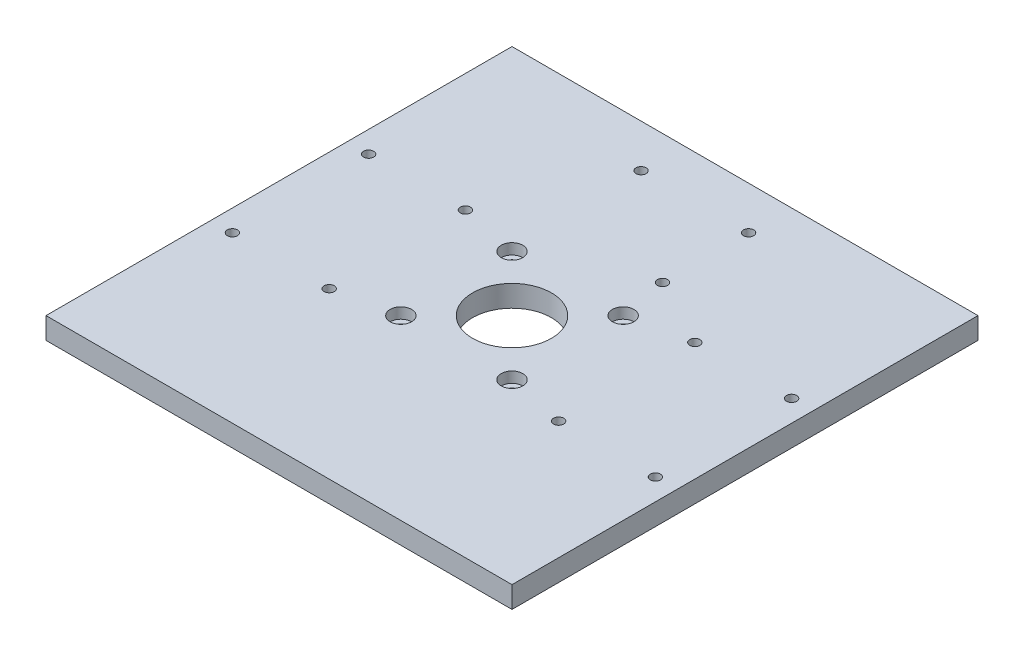
ISO-10303-21;
HEADER;
FILE_DESCRIPTION(('STEP AP214'),'2;1');
FILE_NAME('part.step','',(''),(''),'','','');
FILE_SCHEMA(('AUTOMOTIVE_DESIGN { 1 0 10303 214 1 1 1 1 }'));
ENDSEC;
DATA;
#1=APPLICATION_CONTEXT('core data for automotive mechanical design processes');
#2=APPLICATION_PROTOCOL_DEFINITION('international standard','automotive_design',2000,#1);
#3=PRODUCT_CONTEXT('',#1,'mechanical');
#4=PRODUCT('Part','Part','',(#3));
#5=PRODUCT_RELATED_PRODUCT_CATEGORY('part','',(#4));
#6=PRODUCT_DEFINITION_FORMATION('','',#4);
#7=PRODUCT_DEFINITION_CONTEXT('part definition',#1,'design');
#8=PRODUCT_DEFINITION('design','',#6,#7);
#9=PRODUCT_DEFINITION_SHAPE('','',#8);
#10=(LENGTH_UNIT() NAMED_UNIT(*) SI_UNIT(.MILLI.,.METRE.));
#11=(NAMED_UNIT(*) PLANE_ANGLE_UNIT() SI_UNIT($,.RADIAN.));
#12=(NAMED_UNIT(*) SI_UNIT($,.STERADIAN.) SOLID_ANGLE_UNIT());
#13=UNCERTAINTY_MEASURE_WITH_UNIT(LENGTH_MEASURE(1.E-05),#10,'distance_accuracy_value','');
#14=(GEOMETRIC_REPRESENTATION_CONTEXT(3) GLOBAL_UNCERTAINTY_ASSIGNED_CONTEXT((#13)) GLOBAL_UNIT_ASSIGNED_CONTEXT((#10,
#11,#12)) REPRESENTATION_CONTEXT('',''));
#15=CARTESIAN_POINT('',(0.,0.,0.));
#16=DIRECTION('',(0.,0.,1.));
#17=DIRECTION('',(1.,0.,0.));
#18=AXIS2_PLACEMENT_3D('',#15,#16,#17);
#19=CARTESIAN_POINT('',(-15.4999999999997,0.,15.5));
#20=DIRECTION('',(0.,1.,0.));
#21=DIRECTION('',(0.,0.,1.));
#22=AXIS2_PLACEMENT_3D('',#19,#20,#21);
#23=CYLINDRICAL_SURFACE('',#22,1.42);
#24=CARTESIAN_POINT('',(-15.4999999999997,0.,15.5));
#25=DIRECTION('',(0.,1.,0.));
#26=DIRECTION('',(0.,0.,1.));
#27=AXIS2_PLACEMENT_3D('',#24,#25,#26);
#28=CIRCLE('',#27,1.42);
#29=CARTESIAN_POINT('',(-15.4999999999997,0.,16.92));
#30=VERTEX_POINT('',#29);
#31=EDGE_CURVE('E118',#30,#30,#28,.T.);
#32=ORIENTED_EDGE('',*,*,#31,.F.);
#33=EDGE_LOOP('',(#32));
#34=FACE_BOUND('',#33,.T.);
#35=CARTESIAN_POINT('',(-15.4999999999997,3.,15.5));
#36=DIRECTION('',(0.,1.,0.));
#37=DIRECTION('',(0.,0.,1.));
#38=AXIS2_PLACEMENT_3D('',#35,#36,#37);
#39=CIRCLE('',#38,1.42);
#40=CARTESIAN_POINT('',(-15.4999999999997,3.,16.92));
#41=VERTEX_POINT('',#40);
#42=EDGE_CURVE('E127',#41,#41,#39,.F.);
#43=ORIENTED_EDGE('',*,*,#42,.F.);
#44=EDGE_LOOP('',(#43));
#45=FACE_BOUND('',#44,.T.);
#46=ADVANCED_FACE('F38',(#34,#45),#23,.F.);
#47=CARTESIAN_POINT('',(15.5000000000003,0.,15.5));
#48=DIRECTION('',(0.,1.,0.));
#49=DIRECTION('',(0.,0.,1.));
#50=AXIS2_PLACEMENT_3D('',#47,#48,#49);
#51=CYLINDRICAL_SURFACE('',#50,1.42);
#52=CARTESIAN_POINT('',(15.5000000000003,0.,15.5));
#53=DIRECTION('',(0.,1.,0.));
#54=DIRECTION('',(0.,0.,1.));
#55=AXIS2_PLACEMENT_3D('',#52,#53,#54);
#56=CIRCLE('',#55,1.42);
#57=CARTESIAN_POINT('',(15.5000000000003,0.,16.92));
#58=VERTEX_POINT('',#57);
#59=EDGE_CURVE('E223',#58,#58,#56,.T.);
#60=ORIENTED_EDGE('',*,*,#59,.F.);
#61=EDGE_LOOP('',(#60));
#62=FACE_BOUND('',#61,.T.);
#63=CARTESIAN_POINT('',(15.5000000000003,3.,15.5));
#64=DIRECTION('',(0.,1.,0.));
#65=DIRECTION('',(0.,0.,1.));
#66=AXIS2_PLACEMENT_3D('',#63,#64,#65);
#67=CIRCLE('',#66,1.42);
#68=CARTESIAN_POINT('',(15.5000000000003,3.,16.92));
#69=VERTEX_POINT('',#68);
#70=EDGE_CURVE('E123',#69,#69,#67,.F.);
#71=ORIENTED_EDGE('',*,*,#70,.F.);
#72=EDGE_LOOP('',(#71));
#73=FACE_BOUND('',#72,.T.);
#74=ADVANCED_FACE('F255',(#62,#73),#51,.F.);
#75=CARTESIAN_POINT('',(15.5,0.,-15.5));
#76=DIRECTION('',(0.,1.,0.));
#77=DIRECTION('',(0.,0.,1.));
#78=AXIS2_PLACEMENT_3D('',#75,#76,#77);
#79=CYLINDRICAL_SURFACE('',#78,1.42);
#80=CARTESIAN_POINT('',(15.5,0.,-15.5));
#81=DIRECTION('',(0.,1.,0.));
#82=DIRECTION('',(0.,0.,1.));
#83=AXIS2_PLACEMENT_3D('',#80,#81,#82);
#84=CIRCLE('',#83,1.42);
#85=CARTESIAN_POINT('',(15.5,0.,-14.08));
#86=VERTEX_POINT('',#85);
#87=EDGE_CURVE('E219',#86,#86,#84,.T.);
#88=ORIENTED_EDGE('',*,*,#87,.F.);
#89=EDGE_LOOP('',(#88));
#90=FACE_BOUND('',#89,.T.);
#91=CARTESIAN_POINT('',(15.5,3.,-15.5));
#92=DIRECTION('',(0.,1.,0.));
#93=DIRECTION('',(0.,0.,1.));
#94=AXIS2_PLACEMENT_3D('',#91,#92,#93);
#95=CIRCLE('',#94,1.42);
#96=CARTESIAN_POINT('',(15.5,3.,-14.08));
#97=VERTEX_POINT('',#96);
#98=EDGE_CURVE('E120',#97,#97,#95,.F.);
#99=ORIENTED_EDGE('',*,*,#98,.F.);
#100=EDGE_LOOP('',(#99));
#101=FACE_BOUND('',#100,.T.);
#102=ADVANCED_FACE('F261',(#90,#101),#79,.F.);
#103=CARTESIAN_POINT('',(-15.5,0.,-15.5));
#104=DIRECTION('',(0.,1.,0.));
#105=DIRECTION('',(0.,0.,1.));
#106=AXIS2_PLACEMENT_3D('',#103,#104,#105);
#107=CYLINDRICAL_SURFACE('',#106,1.42);
#108=CARTESIAN_POINT('',(-15.5,0.,-15.5));
#109=DIRECTION('',(0.,1.,0.));
#110=DIRECTION('',(0.,0.,1.));
#111=AXIS2_PLACEMENT_3D('',#108,#109,#110);
#112=CIRCLE('',#111,1.42);
#113=CARTESIAN_POINT('',(-15.5,0.,-14.08));
#114=VERTEX_POINT('',#113);
#115=EDGE_CURVE('E222',#114,#114,#112,.T.);
#116=ORIENTED_EDGE('',*,*,#115,.F.);
#117=EDGE_LOOP('',(#116));
#118=FACE_BOUND('',#117,.T.);
#119=CARTESIAN_POINT('',(-15.5,3.,-15.5));
#120=DIRECTION('',(0.,1.,0.));
#121=DIRECTION('',(0.,0.,1.));
#122=AXIS2_PLACEMENT_3D('',#119,#120,#121);
#123=CIRCLE('',#122,1.42);
#124=CARTESIAN_POINT('',(-15.5,3.,-14.08));
#125=VERTEX_POINT('',#124);
#126=EDGE_CURVE('E115',#125,#125,#123,.F.);
#127=ORIENTED_EDGE('',*,*,#126,.F.);
#128=EDGE_LOOP('',(#127));
#129=FACE_BOUND('',#128,.T.);
#130=ADVANCED_FACE('F267',(#118,#129),#107,.F.);
#131=CARTESIAN_POINT('',(0.,6.,0.));
#132=DIRECTION('',(0.,-1.,0.));
#133=DIRECTION('',(0.,0.,-1.));
#134=AXIS2_PLACEMENT_3D('',#131,#132,#133);
#135=PLANE('',#134);
#136=CARTESIAN_POINT('',(-17.,6.,-53.));
#137=DIRECTION('',(0.,1.,0.));
#138=DIRECTION('',(0.,0.,1.));
#139=AXIS2_PLACEMENT_3D('',#136,#137,#138);
#140=CIRCLE('',#139,1.42);
#141=CARTESIAN_POINT('',(-17.,6.,-51.58));
#142=VERTEX_POINT('',#141);
#143=EDGE_CURVE('E164',#142,#142,#140,.T.);
#144=ORIENTED_EDGE('',*,*,#143,.F.);
#145=EDGE_LOOP('',(#144));
#146=FACE_BOUND('',#145,.T.);
#147=CARTESIAN_POINT('',(13.,6.,-29.));
#148=DIRECTION('',(0.,1.,0.));
#149=DIRECTION('',(0.,0.,1.));
#150=AXIS2_PLACEMENT_3D('',#147,#148,#149);
#151=CIRCLE('',#150,1.42);
#152=CARTESIAN_POINT('',(13.,6.,-27.58));
#153=VERTEX_POINT('',#152);
#154=EDGE_CURVE('E169',#153,#153,#151,.T.);
#155=ORIENTED_EDGE('',*,*,#154,.F.);
#156=EDGE_LOOP('',(#155));
#157=FACE_BOUND('',#156,.T.);
#158=CARTESIAN_POINT('',(13.,6.,-53.));
#159=DIRECTION('',(0.,1.,0.));
#160=DIRECTION('',(0.,0.,1.));
#161=AXIS2_PLACEMENT_3D('',#158,#159,#160);
#162=CIRCLE('',#161,1.42);
#163=CARTESIAN_POINT('',(13.,6.,-51.58));
#164=VERTEX_POINT('',#163);
#165=EDGE_CURVE('E161',#164,#164,#162,.T.);
#166=ORIENTED_EDGE('',*,*,#165,.F.);
#167=EDGE_LOOP('',(#166));
#168=FACE_BOUND('',#167,.T.);
#169=CARTESIAN_POINT('',(-32.0000000000004,6.,-19.));
#170=DIRECTION('',(0.,1.,0.));
#171=DIRECTION('',(0.,0.,1.));
#172=AXIS2_PLACEMENT_3D('',#169,#170,#171);
#173=CIRCLE('',#172,1.42);
#174=CARTESIAN_POINT('',(-32.0000000000004,6.,-17.58));
#175=VERTEX_POINT('',#174);
#176=EDGE_CURVE('E140',#175,#175,#173,.T.);
#177=ORIENTED_EDGE('',*,*,#176,.F.);
#178=EDGE_LOOP('',(#177));
#179=FACE_BOUND('',#178,.T.);
#180=CARTESIAN_POINT('',(-32.,6.,19.));
#181=DIRECTION('',(0.,1.,0.));
#182=DIRECTION('',(0.,0.,1.));
#183=AXIS2_PLACEMENT_3D('',#180,#181,#182);
#184=CIRCLE('',#183,1.42);
#185=CARTESIAN_POINT('',(-32.,6.,20.42));
#186=VERTEX_POINT('',#185);
#187=EDGE_CURVE('E180',#186,#186,#184,.T.);
#188=ORIENTED_EDGE('',*,*,#187,.F.);
#189=EDGE_LOOP('',(#188));
#190=FACE_BOUND('',#189,.T.);
#191=CARTESIAN_POINT('',(-59.,6.,19.));
#192=DIRECTION('',(0.,1.,0.));
#193=DIRECTION('',(0.,0.,1.));
#194=AXIS2_PLACEMENT_3D('',#191,#192,#193);
#195=CIRCLE('',#194,1.42);
#196=CARTESIAN_POINT('',(-59.,6.,20.42));
#197=VERTEX_POINT('',#196);
#198=EDGE_CURVE('E183',#197,#197,#195,.T.);
#199=ORIENTED_EDGE('',*,*,#198,.F.);
#200=EDGE_LOOP('',(#199));
#201=FACE_BOUND('',#200,.T.);
#202=CARTESIAN_POINT('',(59.0000000000004,6.,-19.));
#203=DIRECTION('',(0.,1.,0.));
#204=DIRECTION('',(0.,0.,-1.));
#205=AXIS2_PLACEMENT_3D('',#202,#203,#204);
#206=CIRCLE('',#205,1.42);
#207=CARTESIAN_POINT('',(59.0000000000004,6.,-20.42));
#208=VERTEX_POINT('',#207);
#209=EDGE_CURVE('E186',#208,#208,#206,.T.);
#210=ORIENTED_EDGE('',*,*,#209,.F.);
#211=EDGE_LOOP('',(#210));
#212=FACE_BOUND('',#211,.T.);
#213=CARTESIAN_POINT('',(59.,6.,18.9999999999999));
#214=DIRECTION('',(0.,1.,0.));
#215=DIRECTION('',(0.,0.,-1.));
#216=AXIS2_PLACEMENT_3D('',#213,#214,#215);
#217=CIRCLE('',#216,1.42);
#218=CARTESIAN_POINT('',(59.,6.,17.5799999999999));
#219=VERTEX_POINT('',#218);
#220=EDGE_CURVE('E189',#219,#219,#217,.T.);
#221=ORIENTED_EDGE('',*,*,#220,.F.);
#222=EDGE_LOOP('',(#221));
#223=FACE_BOUND('',#222,.T.);
#224=CARTESIAN_POINT('',(32.,6.,18.9999999999999));
#225=DIRECTION('',(0.,1.,0.));
#226=DIRECTION('',(0.,0.,-1.));
#227=AXIS2_PLACEMENT_3D('',#224,#225,#226);
#228=CIRCLE('',#227,1.42);
#229=CARTESIAN_POINT('',(32.,6.,17.5799999999999));
#230=VERTEX_POINT('',#229);
#231=EDGE_CURVE('E192',#230,#230,#228,.T.);
#232=ORIENTED_EDGE('',*,*,#231,.F.);
#233=EDGE_LOOP('',(#232));
#234=FACE_BOUND('',#233,.T.);
#235=CARTESIAN_POINT('',(32.0000000000004,6.,-19.));
#236=DIRECTION('',(0.,1.,0.));
#237=DIRECTION('',(0.,0.,-1.));
#238=AXIS2_PLACEMENT_3D('',#235,#236,#237);
#239=CIRCLE('',#238,1.42);
#240=CARTESIAN_POINT('',(32.0000000000004,6.,-20.42));
#241=VERTEX_POINT('',#240);
#242=EDGE_CURVE('E160',#241,#241,#239,.T.);
#243=ORIENTED_EDGE('',*,*,#242,.F.);
#244=EDGE_LOOP('',(#243));
#245=FACE_BOUND('',#244,.T.);
#246=CARTESIAN_POINT('',(-59.0000000000004,6.,-19.));
#247=DIRECTION('',(0.,1.,0.));
#248=DIRECTION('',(0.,0.,1.));
#249=AXIS2_PLACEMENT_3D('',#246,#247,#248);
#250=CIRCLE('',#249,1.42);
#251=CARTESIAN_POINT('',(-59.0000000000004,6.,-17.58));
#252=VERTEX_POINT('',#251);
#253=EDGE_CURVE('E135',#252,#252,#250,.T.);
#254=ORIENTED_EDGE('',*,*,#253,.F.);
#255=EDGE_LOOP('',(#254));
#256=FACE_BOUND('',#255,.T.);
#257=CARTESIAN_POINT('',(15.5,6.,-15.5));
#258=DIRECTION('',(0.,1.,0.));
#259=DIRECTION('',(0.,0.,1.));
#260=AXIS2_PLACEMENT_3D('',#257,#258,#259);
#261=CIRCLE('',#260,3.);
#262=CARTESIAN_POINT('',(15.5,6.,-12.5));
#263=VERTEX_POINT('',#262);
#264=EDGE_CURVE('E201',#263,#263,#261,.T.);
#265=ORIENTED_EDGE('',*,*,#264,.F.);
#266=EDGE_LOOP('',(#265));
#267=FACE_BOUND('',#266,.T.);
#268=CARTESIAN_POINT('',(15.5000000000003,6.,15.5));
#269=DIRECTION('',(0.,1.,0.));
#270=DIRECTION('',(0.,0.,1.));
#271=AXIS2_PLACEMENT_3D('',#268,#269,#270);
#272=CIRCLE('',#271,3.);
#273=CARTESIAN_POINT('',(15.5000000000003,6.,18.5));
#274=VERTEX_POINT('',#273);
#275=EDGE_CURVE('E207',#274,#274,#272,.T.);
#276=ORIENTED_EDGE('',*,*,#275,.F.);
#277=EDGE_LOOP('',(#276));
#278=FACE_BOUND('',#277,.T.);
#279=CARTESIAN_POINT('',(-15.4999999999997,6.,15.5));
#280=DIRECTION('',(0.,1.,0.));
#281=DIRECTION('',(0.,0.,1.));
#282=AXIS2_PLACEMENT_3D('',#279,#280,#281);
#283=CIRCLE('',#282,3.);
#284=CARTESIAN_POINT('',(-15.4999999999997,6.,18.5));
#285=VERTEX_POINT('',#284);
#286=EDGE_CURVE('E134',#285,#285,#283,.T.);
#287=ORIENTED_EDGE('',*,*,#286,.F.);
#288=EDGE_LOOP('',(#287));
#289=FACE_BOUND('',#288,.T.);
#290=CARTESIAN_POINT('',(-15.5,6.,-15.5));
#291=DIRECTION('',(0.,1.,0.));
#292=DIRECTION('',(0.,0.,1.));
#293=AXIS2_PLACEMENT_3D('',#290,#291,#292);
#294=CIRCLE('',#293,3.);
#295=CARTESIAN_POINT('',(-15.5,6.,-12.5));
#296=VERTEX_POINT('',#295);
#297=EDGE_CURVE('E130',#296,#296,#294,.T.);
#298=ORIENTED_EDGE('',*,*,#297,.F.);
#299=EDGE_LOOP('',(#298));
#300=FACE_BOUND('',#299,.T.);
#301=DIRECTION('',(0.,0.,-1.));
#302=VECTOR('',#301,1.);
#303=CARTESIAN_POINT('',(65.,6.,65.));
#304=LINE('',#303,#302);
#305=CARTESIAN_POINT('',(65.,6.,65.));
#306=VERTEX_POINT('',#305);
#307=CARTESIAN_POINT('',(65.,6.,-65.));
#308=VERTEX_POINT('',#307);
#309=EDGE_CURVE('E93',#306,#308,#304,.T.);
#310=ORIENTED_EDGE('',*,*,#309,.T.);
#311=DIRECTION('',(-1.,0.,0.));
#312=VECTOR('',#311,1.);
#313=CARTESIAN_POINT('',(-65.,6.,-65.));
#314=LINE('',#313,#312);
#315=CARTESIAN_POINT('',(-65.,6.,-65.));
#316=VERTEX_POINT('',#315);
#317=EDGE_CURVE('E87',#308,#316,#314,.T.);
#318=ORIENTED_EDGE('',*,*,#317,.T.);
#319=DIRECTION('',(0.,0.,1.));
#320=VECTOR('',#319,1.);
#321=CARTESIAN_POINT('',(-65.,6.,65.));
#322=LINE('',#321,#320);
#323=CARTESIAN_POINT('',(-65.,6.,65.));
#324=VERTEX_POINT('',#323);
#325=EDGE_CURVE('E91',#316,#324,#322,.T.);
#326=ORIENTED_EDGE('',*,*,#325,.T.);
#327=DIRECTION('',(1.,0.,0.));
#328=VECTOR('',#327,1.);
#329=CARTESIAN_POINT('',(-65.,6.,65.));
#330=LINE('',#329,#328);
#331=EDGE_CURVE('E57',#324,#306,#330,.T.);
#332=ORIENTED_EDGE('',*,*,#331,.T.);
#333=EDGE_LOOP('',(#310,#318,#326,#332));
#334=FACE_BOUND('',#333,.T.);
#335=CARTESIAN_POINT('',(0.,6.,0.));
#336=DIRECTION('',(0.,1.,0.));
#337=DIRECTION('',(0.,0.,1.));
#338=AXIS2_PLACEMENT_3D('',#335,#336,#337);
#339=CIRCLE('',#338,11.);
#340=CARTESIAN_POINT('',(0.,6.,11.));
#341=VERTEX_POINT('',#340);
#342=EDGE_CURVE('E109',#341,#341,#339,.T.);
#343=ORIENTED_EDGE('',*,*,#342,.F.);
#344=EDGE_LOOP('',(#343));
#345=FACE_BOUND('',#344,.T.);
#346=ADVANCED_FACE('F88',(#146,#157,#168,#179,#190,#201,#212,#223,#234,#245,#256,#267,#278,#289,
#300,#334,#345),#135,.F.);
#347=CARTESIAN_POINT('',(0.,0.,0.));
#348=DIRECTION('',(0.,-1.,0.));
#349=DIRECTION('',(0.,0.,-1.));
#350=AXIS2_PLACEMENT_3D('',#347,#348,#349);
#351=PLANE('',#350);
#352=CARTESIAN_POINT('',(-17.,0.,-53.));
#353=DIRECTION('',(0.,-1.,0.));
#354=DIRECTION('',(0.,0.,-1.));
#355=AXIS2_PLACEMENT_3D('',#352,#353,#354);
#356=CIRCLE('',#355,1.42);
#357=CARTESIAN_POINT('',(-17.,0.,-54.42));
#358=VERTEX_POINT('',#357);
#359=EDGE_CURVE('E42',#358,#358,#356,.T.);
#360=ORIENTED_EDGE('',*,*,#359,.F.);
#361=EDGE_LOOP('',(#360));
#362=FACE_BOUND('',#361,.T.);
#363=CARTESIAN_POINT('',(13.,0.,-29.));
#364=DIRECTION('',(0.,-1.,0.));
#365=DIRECTION('',(0.,0.,-1.));
#366=AXIS2_PLACEMENT_3D('',#363,#364,#365);
#367=CIRCLE('',#366,1.42);
#368=CARTESIAN_POINT('',(13.,0.,-30.42));
#369=VERTEX_POINT('',#368);
#370=EDGE_CURVE('E162',#369,#369,#367,.T.);
#371=ORIENTED_EDGE('',*,*,#370,.F.);
#372=EDGE_LOOP('',(#371));
#373=FACE_BOUND('',#372,.T.);
#374=CARTESIAN_POINT('',(13.,0.,-53.));
#375=DIRECTION('',(0.,-1.,0.));
#376=DIRECTION('',(0.,0.,-1.));
#377=AXIS2_PLACEMENT_3D('',#374,#375,#376);
#378=CIRCLE('',#377,1.42);
#379=CARTESIAN_POINT('',(13.,0.,-54.42));
#380=VERTEX_POINT('',#379);
#381=EDGE_CURVE('E158',#380,#380,#378,.T.);
#382=ORIENTED_EDGE('',*,*,#381,.F.);
#383=EDGE_LOOP('',(#382));
#384=FACE_BOUND('',#383,.T.);
#385=CARTESIAN_POINT('',(-32.0000000000004,0.,-19.));
#386=DIRECTION('',(0.,-1.,0.));
#387=DIRECTION('',(0.,0.,-1.));
#388=AXIS2_PLACEMENT_3D('',#385,#386,#387);
#389=CIRCLE('',#388,1.42);
#390=CARTESIAN_POINT('',(-32.0000000000004,0.,-20.42));
#391=VERTEX_POINT('',#390);
#392=EDGE_CURVE('E155',#391,#391,#389,.T.);
#393=ORIENTED_EDGE('',*,*,#392,.F.);
#394=EDGE_LOOP('',(#393));
#395=FACE_BOUND('',#394,.T.);
#396=CARTESIAN_POINT('',(-32.,0.,19.));
#397=DIRECTION('',(0.,-1.,0.));
#398=DIRECTION('',(0.,0.,-1.));
#399=AXIS2_PLACEMENT_3D('',#396,#397,#398);
#400=CIRCLE('',#399,1.42);
#401=CARTESIAN_POINT('',(-32.,0.,17.58));
#402=VERTEX_POINT('',#401);
#403=EDGE_CURVE('E152',#402,#402,#400,.T.);
#404=ORIENTED_EDGE('',*,*,#403,.F.);
#405=EDGE_LOOP('',(#404));
#406=FACE_BOUND('',#405,.T.);
#407=CARTESIAN_POINT('',(-59.,0.,19.));
#408=DIRECTION('',(0.,-1.,0.));
#409=DIRECTION('',(0.,0.,-1.));
#410=AXIS2_PLACEMENT_3D('',#407,#408,#409);
#411=CIRCLE('',#410,1.42);
#412=CARTESIAN_POINT('',(-59.,0.,17.58));
#413=VERTEX_POINT('',#412);
#414=EDGE_CURVE('E149',#413,#413,#411,.T.);
#415=ORIENTED_EDGE('',*,*,#414,.F.);
#416=EDGE_LOOP('',(#415));
#417=FACE_BOUND('',#416,.T.);
#418=CARTESIAN_POINT('',(59.0000000000004,0.,-19.));
#419=DIRECTION('',(0.,-1.,0.));
#420=DIRECTION('',(0.,0.,-1.));
#421=AXIS2_PLACEMENT_3D('',#418,#419,#420);
#422=CIRCLE('',#421,1.42);
#423=CARTESIAN_POINT('',(59.0000000000004,0.,-20.42));
#424=VERTEX_POINT('',#423);
#425=EDGE_CURVE('E146',#424,#424,#422,.T.);
#426=ORIENTED_EDGE('',*,*,#425,.F.);
#427=EDGE_LOOP('',(#426));
#428=FACE_BOUND('',#427,.T.);
#429=CARTESIAN_POINT('',(59.,0.,18.9999999999999));
#430=DIRECTION('',(0.,-1.,0.));
#431=DIRECTION('',(0.,0.,-1.));
#432=AXIS2_PLACEMENT_3D('',#429,#430,#431);
#433=CIRCLE('',#432,1.42);
#434=CARTESIAN_POINT('',(59.,0.,17.5799999999999));
#435=VERTEX_POINT('',#434);
#436=EDGE_CURVE('E143',#435,#435,#433,.T.);
#437=ORIENTED_EDGE('',*,*,#436,.F.);
#438=EDGE_LOOP('',(#437));
#439=FACE_BOUND('',#438,.T.);
#440=CARTESIAN_POINT('',(32.,0.,18.9999999999999));
#441=DIRECTION('',(0.,-1.,0.));
#442=DIRECTION('',(0.,0.,-1.));
#443=AXIS2_PLACEMENT_3D('',#440,#441,#442);
#444=CIRCLE('',#443,1.42);
#445=CARTESIAN_POINT('',(32.,0.,17.5799999999999));
#446=VERTEX_POINT('',#445);
#447=EDGE_CURVE('E139',#446,#446,#444,.T.);
#448=ORIENTED_EDGE('',*,*,#447,.F.);
#449=EDGE_LOOP('',(#448));
#450=FACE_BOUND('',#449,.T.);
#451=CARTESIAN_POINT('',(32.0000000000004,0.,-19.));
#452=DIRECTION('',(0.,-1.,0.));
#453=DIRECTION('',(0.,0.,-1.));
#454=AXIS2_PLACEMENT_3D('',#451,#452,#453);
#455=CIRCLE('',#454,1.42);
#456=CARTESIAN_POINT('',(32.0000000000004,0.,-20.42));
#457=VERTEX_POINT('',#456);
#458=EDGE_CURVE('E136',#457,#457,#455,.T.);
#459=ORIENTED_EDGE('',*,*,#458,.F.);
#460=EDGE_LOOP('',(#459));
#461=FACE_BOUND('',#460,.T.);
#462=CARTESIAN_POINT('',(-59.0000000000004,0.,-19.));
#463=DIRECTION('',(0.,-1.,0.));
#464=DIRECTION('',(0.,0.,-1.));
#465=AXIS2_PLACEMENT_3D('',#462,#463,#464);
#466=CIRCLE('',#465,1.42);
#467=CARTESIAN_POINT('',(-59.0000000000004,0.,-20.42));
#468=VERTEX_POINT('',#467);
#469=EDGE_CURVE('E131',#468,#468,#466,.T.);
#470=ORIENTED_EDGE('',*,*,#469,.F.);
#471=EDGE_LOOP('',(#470));
#472=FACE_BOUND('',#471,.T.);
#473=ORIENTED_EDGE('',*,*,#87,.T.);
#474=EDGE_LOOP('',(#473));
#475=FACE_BOUND('',#474,.T.);
#476=ORIENTED_EDGE('',*,*,#59,.T.);
#477=EDGE_LOOP('',(#476));
#478=FACE_BOUND('',#477,.T.);
#479=ORIENTED_EDGE('',*,*,#31,.T.);
#480=EDGE_LOOP('',(#479));
#481=FACE_BOUND('',#480,.T.);
#482=ORIENTED_EDGE('',*,*,#115,.T.);
#483=EDGE_LOOP('',(#482));
#484=FACE_BOUND('',#483,.T.);
#485=DIRECTION('',(0.,0.,-1.));
#486=VECTOR('',#485,1.);
#487=CARTESIAN_POINT('',(65.,0.,65.));
#488=LINE('',#487,#486);
#489=CARTESIAN_POINT('',(65.,0.,65.));
#490=VERTEX_POINT('',#489);
#491=CARTESIAN_POINT('',(65.,0.,-65.));
#492=VERTEX_POINT('',#491);
#493=EDGE_CURVE('E106',#490,#492,#488,.T.);
#494=ORIENTED_EDGE('',*,*,#493,.F.);
#495=DIRECTION('',(1.,0.,0.));
#496=VECTOR('',#495,1.);
#497=CARTESIAN_POINT('',(-65.,0.,65.));
#498=LINE('',#497,#496);
#499=CARTESIAN_POINT('',(-65.,0.,65.));
#500=VERTEX_POINT('',#499);
#501=EDGE_CURVE('E80',#500,#490,#498,.T.);
#502=ORIENTED_EDGE('',*,*,#501,.F.);
#503=DIRECTION('',(0.,0.,1.));
#504=VECTOR('',#503,1.);
#505=CARTESIAN_POINT('',(-65.,0.,65.));
#506=LINE('',#505,#504);
#507=CARTESIAN_POINT('',(-65.,0.,-65.));
#508=VERTEX_POINT('',#507);
#509=EDGE_CURVE('E74',#508,#500,#506,.T.);
#510=ORIENTED_EDGE('',*,*,#509,.F.);
#511=DIRECTION('',(-1.,0.,0.));
#512=VECTOR('',#511,1.);
#513=CARTESIAN_POINT('',(-65.,0.,-65.));
#514=LINE('',#513,#512);
#515=EDGE_CURVE('E97',#492,#508,#514,.T.);
#516=ORIENTED_EDGE('',*,*,#515,.F.);
#517=EDGE_LOOP('',(#494,#502,#510,#516));
#518=FACE_BOUND('',#517,.T.);
#519=CARTESIAN_POINT('',(0.,0.,0.));
#520=DIRECTION('',(0.,1.,0.));
#521=DIRECTION('',(0.,0.,1.));
#522=AXIS2_PLACEMENT_3D('',#519,#520,#521);
#523=CIRCLE('',#522,11.);
#524=CARTESIAN_POINT('',(0.,0.,11.));
#525=VERTEX_POINT('',#524);
#526=EDGE_CURVE('E230',#525,#525,#523,.T.);
#527=ORIENTED_EDGE('',*,*,#526,.T.);
#528=EDGE_LOOP('',(#527));
#529=FACE_BOUND('',#528,.T.);
#530=ADVANCED_FACE('F236',(#362,#373,#384,#395,#406,#417,#428,#439,#450,#461,#472,#475,#478,
#481,#484,#518,#529),#351,.T.);
#531=CARTESIAN_POINT('',(65.,6.,65.));
#532=DIRECTION('',(-1.,0.,0.));
#533=DIRECTION('',(0.,0.,1.));
#534=AXIS2_PLACEMENT_3D('',#531,#532,#533);
#535=PLANE('',#534);
#536=ORIENTED_EDGE('',*,*,#493,.T.);
#537=DIRECTION('',(0.,-1.,0.));
#538=VECTOR('',#537,1.);
#539=CARTESIAN_POINT('',(65.,6.,-65.));
#540=LINE('',#539,#538);
#541=EDGE_CURVE('E11',#308,#492,#540,.T.);
#542=ORIENTED_EDGE('',*,*,#541,.F.);
#543=ORIENTED_EDGE('',*,*,#309,.F.);
#544=DIRECTION('',(0.,-1.,0.));
#545=VECTOR('',#544,1.);
#546=CARTESIAN_POINT('',(65.,6.,65.));
#547=LINE('',#546,#545);
#548=EDGE_CURVE('E102',#306,#490,#547,.T.);
#549=ORIENTED_EDGE('',*,*,#548,.T.);
#550=EDGE_LOOP('',(#536,#542,#543,#549));
#551=FACE_BOUND('',#550,.T.);
#552=ADVANCED_FACE('F40',(#551),#535,.F.);
#553=CARTESIAN_POINT('',(-65.,6.,-65.));
#554=DIRECTION('',(0.,0.,1.));
#555=DIRECTION('',(1.,0.,0.));
#556=AXIS2_PLACEMENT_3D('',#553,#554,#555);
#557=PLANE('',#556);
#558=ORIENTED_EDGE('',*,*,#515,.T.);
#559=DIRECTION('',(0.,-1.,0.));
#560=VECTOR('',#559,1.);
#561=CARTESIAN_POINT('',(-65.,6.,-65.));
#562=LINE('',#561,#560);
#563=EDGE_CURVE('E48',#316,#508,#562,.T.);
#564=ORIENTED_EDGE('',*,*,#563,.F.);
#565=ORIENTED_EDGE('',*,*,#317,.F.);
#566=ORIENTED_EDGE('',*,*,#541,.T.);
#567=EDGE_LOOP('',(#558,#564,#565,#566));
#568=FACE_BOUND('',#567,.T.);
#569=ADVANCED_FACE('F96',(#568),#557,.F.);
#570=CARTESIAN_POINT('',(-65.,6.,65.));
#571=DIRECTION('',(1.,0.,0.));
#572=DIRECTION('',(0.,0.,-1.));
#573=AXIS2_PLACEMENT_3D('',#570,#571,#572);
#574=PLANE('',#573);
#575=ORIENTED_EDGE('',*,*,#509,.T.);
#576=DIRECTION('',(0.,-1.,0.));
#577=VECTOR('',#576,1.);
#578=CARTESIAN_POINT('',(-65.,6.,65.));
#579=LINE('',#578,#577);
#580=EDGE_CURVE('E98',#324,#500,#579,.T.);
#581=ORIENTED_EDGE('',*,*,#580,.F.);
#582=ORIENTED_EDGE('',*,*,#325,.F.);
#583=ORIENTED_EDGE('',*,*,#563,.T.);
#584=EDGE_LOOP('',(#575,#581,#582,#583));
#585=FACE_BOUND('',#584,.T.);
#586=ADVANCED_FACE('F100',(#585),#574,.F.);
#587=CARTESIAN_POINT('',(-65.,6.,65.));
#588=DIRECTION('',(0.,0.,-1.));
#589=DIRECTION('',(-1.,0.,0.));
#590=AXIS2_PLACEMENT_3D('',#587,#588,#589);
#591=PLANE('',#590);
#592=ORIENTED_EDGE('',*,*,#501,.T.);
#593=ORIENTED_EDGE('',*,*,#548,.F.);
#594=ORIENTED_EDGE('',*,*,#331,.F.);
#595=ORIENTED_EDGE('',*,*,#580,.T.);
#596=EDGE_LOOP('',(#592,#593,#594,#595));
#597=FACE_BOUND('',#596,.T.);
#598=ADVANCED_FACE('F241',(#597),#591,.F.);
#599=CARTESIAN_POINT('',(0.,6.,0.));
#600=DIRECTION('',(0.,-1.,0.));
#601=DIRECTION('',(0.,0.,-1.));
#602=AXIS2_PLACEMENT_3D('',#599,#600,#601);
#603=CYLINDRICAL_SURFACE('',#602,11.);
#604=ORIENTED_EDGE('',*,*,#342,.T.);
#605=EDGE_LOOP('',(#604));
#606=FACE_BOUND('',#605,.T.);
#607=ORIENTED_EDGE('',*,*,#526,.F.);
#608=EDGE_LOOP('',(#607));
#609=FACE_BOUND('',#608,.T.);
#610=ADVANCED_FACE('F238',(#606,#609),#603,.F.);
#611=CARTESIAN_POINT('',(-15.5,3.,-15.5));
#612=DIRECTION('',(0.,1.,0.));
#613=DIRECTION('',(0.,0.,1.));
#614=AXIS2_PLACEMENT_3D('',#611,#612,#613);
#615=PLANE('',#614);
#616=CARTESIAN_POINT('',(-15.5,3.,-15.5));
#617=DIRECTION('',(0.,1.,0.));
#618=DIRECTION('',(0.,0.,1.));
#619=AXIS2_PLACEMENT_3D('',#616,#617,#618);
#620=CIRCLE('',#619,3.);
#621=CARTESIAN_POINT('',(-15.5,3.,-12.5));
#622=VERTEX_POINT('',#621);
#623=EDGE_CURVE('E119',#622,#622,#620,.T.);
#624=ORIENTED_EDGE('',*,*,#623,.T.);
#625=EDGE_LOOP('',(#624));
#626=FACE_BOUND('',#625,.T.);
#627=ORIENTED_EDGE('',*,*,#126,.T.);
#628=EDGE_LOOP('',(#627));
#629=FACE_BOUND('',#628,.T.);
#630=ADVANCED_FACE('F240',(#626,#629),#615,.T.);
#631=CARTESIAN_POINT('',(-15.5,3.,-15.5));
#632=DIRECTION('',(0.,1.,0.));
#633=DIRECTION('',(0.,0.,1.));
#634=AXIS2_PLACEMENT_3D('',#631,#632,#633);
#635=CYLINDRICAL_SURFACE('',#634,3.);
#636=ORIENTED_EDGE('',*,*,#623,.F.);
#637=EDGE_LOOP('',(#636));
#638=FACE_BOUND('',#637,.T.);
#639=ORIENTED_EDGE('',*,*,#297,.T.);
#640=EDGE_LOOP('',(#639));
#641=FACE_BOUND('',#640,.T.);
#642=ADVANCED_FACE('F248',(#638,#641),#635,.F.);
#643=CARTESIAN_POINT('',(15.5,3.,-15.5));
#644=DIRECTION('',(0.,1.,0.));
#645=DIRECTION('',(0.,0.,1.));
#646=AXIS2_PLACEMENT_3D('',#643,#644,#645);
#647=PLANE('',#646);
#648=CARTESIAN_POINT('',(15.5,3.,-15.5));
#649=DIRECTION('',(0.,1.,0.));
#650=DIRECTION('',(0.,0.,1.));
#651=AXIS2_PLACEMENT_3D('',#648,#649,#650);
#652=CIRCLE('',#651,3.);
#653=CARTESIAN_POINT('',(15.5,3.,-12.5));
#654=VERTEX_POINT('',#653);
#655=EDGE_CURVE('E124',#654,#654,#652,.T.);
#656=ORIENTED_EDGE('',*,*,#655,.T.);
#657=EDGE_LOOP('',(#656));
#658=FACE_BOUND('',#657,.T.);
#659=ORIENTED_EDGE('',*,*,#98,.T.);
#660=EDGE_LOOP('',(#659));
#661=FACE_BOUND('',#660,.T.);
#662=ADVANCED_FACE('F342',(#658,#661),#647,.T.);
#663=CARTESIAN_POINT('',(15.5,3.,-15.5));
#664=DIRECTION('',(0.,1.,0.));
#665=DIRECTION('',(0.,0.,1.));
#666=AXIS2_PLACEMENT_3D('',#663,#664,#665);
#667=CYLINDRICAL_SURFACE('',#666,3.);
#668=ORIENTED_EDGE('',*,*,#655,.F.);
#669=EDGE_LOOP('',(#668));
#670=FACE_BOUND('',#669,.T.);
#671=ORIENTED_EDGE('',*,*,#264,.T.);
#672=EDGE_LOOP('',(#671));
#673=FACE_BOUND('',#672,.T.);
#674=ADVANCED_FACE('F352',(#670,#673),#667,.F.);
#675=CARTESIAN_POINT('',(15.5000000000003,3.,15.5));
#676=DIRECTION('',(0.,1.,0.));
#677=DIRECTION('',(0.,0.,1.));
#678=AXIS2_PLACEMENT_3D('',#675,#676,#677);
#679=PLANE('',#678);
#680=CARTESIAN_POINT('',(15.5000000000003,3.,15.5));
#681=DIRECTION('',(0.,1.,0.));
#682=DIRECTION('',(0.,0.,1.));
#683=AXIS2_PLACEMENT_3D('',#680,#681,#682);
#684=CIRCLE('',#683,3.);
#685=CARTESIAN_POINT('',(15.5000000000003,3.,18.5));
#686=VERTEX_POINT('',#685);
#687=EDGE_CURVE('E204',#686,#686,#684,.T.);
#688=ORIENTED_EDGE('',*,*,#687,.T.);
#689=EDGE_LOOP('',(#688));
#690=FACE_BOUND('',#689,.T.);
#691=ORIENTED_EDGE('',*,*,#70,.T.);
#692=EDGE_LOOP('',(#691));
#693=FACE_BOUND('',#692,.T.);
#694=ADVANCED_FACE('F362',(#690,#693),#679,.T.);
#695=CARTESIAN_POINT('',(15.5000000000003,3.,15.5));
#696=DIRECTION('',(0.,1.,0.));
#697=DIRECTION('',(0.,0.,1.));
#698=AXIS2_PLACEMENT_3D('',#695,#696,#697);
#699=CYLINDRICAL_SURFACE('',#698,3.);
#700=ORIENTED_EDGE('',*,*,#687,.F.);
#701=EDGE_LOOP('',(#700));
#702=FACE_BOUND('',#701,.T.);
#703=ORIENTED_EDGE('',*,*,#275,.T.);
#704=EDGE_LOOP('',(#703));
#705=FACE_BOUND('',#704,.T.);
#706=ADVANCED_FACE('F372',(#702,#705),#699,.F.);
#707=CARTESIAN_POINT('',(-15.4999999999997,3.,15.5));
#708=DIRECTION('',(0.,1.,0.));
#709=DIRECTION('',(0.,0.,1.));
#710=AXIS2_PLACEMENT_3D('',#707,#708,#709);
#711=PLANE('',#710);
#712=CARTESIAN_POINT('',(-15.4999999999997,3.,15.5));
#713=DIRECTION('',(0.,1.,0.));
#714=DIRECTION('',(0.,0.,1.));
#715=AXIS2_PLACEMENT_3D('',#712,#713,#714);
#716=CIRCLE('',#715,3.);
#717=CARTESIAN_POINT('',(-15.4999999999997,3.,18.5));
#718=VERTEX_POINT('',#717);
#719=EDGE_CURVE('E210',#718,#718,#716,.T.);
#720=ORIENTED_EDGE('',*,*,#719,.T.);
#721=EDGE_LOOP('',(#720));
#722=FACE_BOUND('',#721,.T.);
#723=ORIENTED_EDGE('',*,*,#42,.T.);
#724=EDGE_LOOP('',(#723));
#725=FACE_BOUND('',#724,.T.);
#726=ADVANCED_FACE('F382',(#722,#725),#711,.T.);
#727=CARTESIAN_POINT('',(-15.4999999999997,3.,15.5));
#728=DIRECTION('',(0.,1.,0.));
#729=DIRECTION('',(0.,0.,1.));
#730=AXIS2_PLACEMENT_3D('',#727,#728,#729);
#731=CYLINDRICAL_SURFACE('',#730,3.);
#732=ORIENTED_EDGE('',*,*,#719,.F.);
#733=EDGE_LOOP('',(#732));
#734=FACE_BOUND('',#733,.T.);
#735=ORIENTED_EDGE('',*,*,#286,.T.);
#736=EDGE_LOOP('',(#735));
#737=FACE_BOUND('',#736,.T.);
#738=ADVANCED_FACE('F392',(#734,#737),#731,.F.);
#739=CARTESIAN_POINT('',(-59.0000000000004,-4.,-19.));
#740=DIRECTION('',(0.,1.,0.));
#741=DIRECTION('',(0.,0.,1.));
#742=AXIS2_PLACEMENT_3D('',#739,#740,#741);
#743=CYLINDRICAL_SURFACE('',#742,1.42);
#744=ORIENTED_EDGE('',*,*,#469,.T.);
#745=EDGE_LOOP('',(#744));
#746=FACE_BOUND('',#745,.T.);
#747=ORIENTED_EDGE('',*,*,#253,.T.);
#748=EDGE_LOOP('',(#747));
#749=FACE_BOUND('',#748,.T.);
#750=ADVANCED_FACE('F402',(#746,#749),#743,.F.);
#751=CARTESIAN_POINT('',(32.0000000000004,-4.,-19.));
#752=DIRECTION('',(0.,1.,0.));
#753=DIRECTION('',(0.,0.,1.));
#754=AXIS2_PLACEMENT_3D('',#751,#752,#753);
#755=CYLINDRICAL_SURFACE('',#754,1.42);
#756=ORIENTED_EDGE('',*,*,#458,.T.);
#757=EDGE_LOOP('',(#756));
#758=FACE_BOUND('',#757,.T.);
#759=ORIENTED_EDGE('',*,*,#242,.T.);
#760=EDGE_LOOP('',(#759));
#761=FACE_BOUND('',#760,.T.);
#762=ADVANCED_FACE('F412',(#758,#761),#755,.F.);
#763=CARTESIAN_POINT('',(32.,-4.,18.9999999999999));
#764=DIRECTION('',(0.,1.,0.));
#765=DIRECTION('',(0.,0.,1.));
#766=AXIS2_PLACEMENT_3D('',#763,#764,#765);
#767=CYLINDRICAL_SURFACE('',#766,1.42);
#768=ORIENTED_EDGE('',*,*,#447,.T.);
#769=EDGE_LOOP('',(#768));
#770=FACE_BOUND('',#769,.T.);
#771=ORIENTED_EDGE('',*,*,#231,.T.);
#772=EDGE_LOOP('',(#771));
#773=FACE_BOUND('',#772,.T.);
#774=ADVANCED_FACE('F422',(#770,#773),#767,.F.);
#775=CARTESIAN_POINT('',(59.,-4.,18.9999999999999));
#776=DIRECTION('',(0.,1.,0.));
#777=DIRECTION('',(0.,0.,1.));
#778=AXIS2_PLACEMENT_3D('',#775,#776,#777);
#779=CYLINDRICAL_SURFACE('',#778,1.42);
#780=ORIENTED_EDGE('',*,*,#436,.T.);
#781=EDGE_LOOP('',(#780));
#782=FACE_BOUND('',#781,.T.);
#783=ORIENTED_EDGE('',*,*,#220,.T.);
#784=EDGE_LOOP('',(#783));
#785=FACE_BOUND('',#784,.T.);
#786=ADVANCED_FACE('F432',(#782,#785),#779,.F.);
#787=CARTESIAN_POINT('',(59.0000000000004,-4.,-19.));
#788=DIRECTION('',(0.,1.,0.));
#789=DIRECTION('',(0.,0.,1.));
#790=AXIS2_PLACEMENT_3D('',#787,#788,#789);
#791=CYLINDRICAL_SURFACE('',#790,1.42);
#792=ORIENTED_EDGE('',*,*,#425,.T.);
#793=EDGE_LOOP('',(#792));
#794=FACE_BOUND('',#793,.T.);
#795=ORIENTED_EDGE('',*,*,#209,.T.);
#796=EDGE_LOOP('',(#795));
#797=FACE_BOUND('',#796,.T.);
#798=ADVANCED_FACE('F442',(#794,#797),#791,.F.);
#799=CARTESIAN_POINT('',(-59.,-4.,19.));
#800=DIRECTION('',(0.,1.,0.));
#801=DIRECTION('',(0.,0.,1.));
#802=AXIS2_PLACEMENT_3D('',#799,#800,#801);
#803=CYLINDRICAL_SURFACE('',#802,1.42);
#804=ORIENTED_EDGE('',*,*,#414,.T.);
#805=EDGE_LOOP('',(#804));
#806=FACE_BOUND('',#805,.T.);
#807=ORIENTED_EDGE('',*,*,#198,.T.);
#808=EDGE_LOOP('',(#807));
#809=FACE_BOUND('',#808,.T.);
#810=ADVANCED_FACE('F452',(#806,#809),#803,.F.);
#811=CARTESIAN_POINT('',(-32.,-4.,19.));
#812=DIRECTION('',(0.,1.,0.));
#813=DIRECTION('',(0.,0.,1.));
#814=AXIS2_PLACEMENT_3D('',#811,#812,#813);
#815=CYLINDRICAL_SURFACE('',#814,1.42);
#816=ORIENTED_EDGE('',*,*,#403,.T.);
#817=EDGE_LOOP('',(#816));
#818=FACE_BOUND('',#817,.T.);
#819=ORIENTED_EDGE('',*,*,#187,.T.);
#820=EDGE_LOOP('',(#819));
#821=FACE_BOUND('',#820,.T.);
#822=ADVANCED_FACE('F462',(#818,#821),#815,.F.);
#823=CARTESIAN_POINT('',(-32.0000000000004,-4.,-19.));
#824=DIRECTION('',(0.,1.,0.));
#825=DIRECTION('',(0.,0.,1.));
#826=AXIS2_PLACEMENT_3D('',#823,#824,#825);
#827=CYLINDRICAL_SURFACE('',#826,1.42);
#828=ORIENTED_EDGE('',*,*,#392,.T.);
#829=EDGE_LOOP('',(#828));
#830=FACE_BOUND('',#829,.T.);
#831=ORIENTED_EDGE('',*,*,#176,.T.);
#832=EDGE_LOOP('',(#831));
#833=FACE_BOUND('',#832,.T.);
#834=ADVANCED_FACE('F472',(#830,#833),#827,.F.);
#835=CARTESIAN_POINT('',(13.,-4.,-53.));
#836=DIRECTION('',(0.,1.,0.));
#837=DIRECTION('',(0.,0.,1.));
#838=AXIS2_PLACEMENT_3D('',#835,#836,#837);
#839=CYLINDRICAL_SURFACE('',#838,1.42);
#840=ORIENTED_EDGE('',*,*,#381,.T.);
#841=EDGE_LOOP('',(#840));
#842=FACE_BOUND('',#841,.T.);
#843=ORIENTED_EDGE('',*,*,#165,.T.);
#844=EDGE_LOOP('',(#843));
#845=FACE_BOUND('',#844,.T.);
#846=ADVANCED_FACE('F481',(#842,#845),#839,.F.);
#847=CARTESIAN_POINT('',(13.,-4.,-29.));
#848=DIRECTION('',(0.,1.,0.));
#849=DIRECTION('',(0.,0.,1.));
#850=AXIS2_PLACEMENT_3D('',#847,#848,#849);
#851=CYLINDRICAL_SURFACE('',#850,1.42);
#852=ORIENTED_EDGE('',*,*,#370,.T.);
#853=EDGE_LOOP('',(#852));
#854=FACE_BOUND('',#853,.T.);
#855=ORIENTED_EDGE('',*,*,#154,.T.);
#856=EDGE_LOOP('',(#855));
#857=FACE_BOUND('',#856,.T.);
#858=ADVANCED_FACE('F498',(#854,#857),#851,.F.);
#859=CARTESIAN_POINT('',(-17.,-4.,-53.));
#860=DIRECTION('',(0.,1.,0.));
#861=DIRECTION('',(0.,0.,1.));
#862=AXIS2_PLACEMENT_3D('',#859,#860,#861);
#863=CYLINDRICAL_SURFACE('',#862,1.42);
#864=ORIENTED_EDGE('',*,*,#359,.T.);
#865=EDGE_LOOP('',(#864));
#866=FACE_BOUND('',#865,.T.);
#867=ORIENTED_EDGE('',*,*,#143,.T.);
#868=EDGE_LOOP('',(#867));
#869=FACE_BOUND('',#868,.T.);
#870=ADVANCED_FACE('F508',(#866,#869),#863,.F.);
#871=CLOSED_SHELL('',(#46,#74,#102,#130,#346,#530,#552,#569,#586,#598,#610,#630,#642,#662,#674,
#694,#706,#726,#738,#750,#762,#774,#786,#798,#810,#822,#834,#846,#858,#870));
#872=MANIFOLD_SOLID_BREP('B2',#871);
#873=ADVANCED_BREP_SHAPE_REPRESENTATION('',(#18,#872),#14);
#874=SHAPE_DEFINITION_REPRESENTATION(#9,#873);
ENDSEC;
END-ISO-10303-21;
